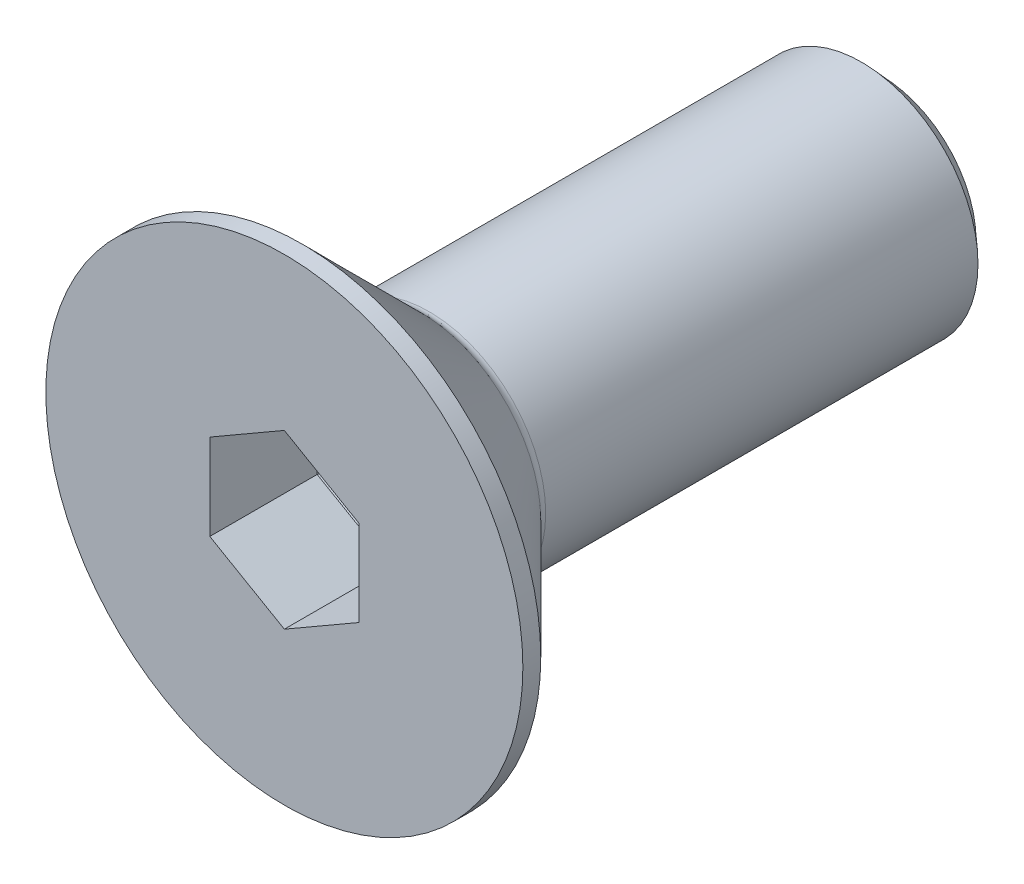
ISO-10303-21;
HEADER;
FILE_DESCRIPTION(('STEP AP214'),'2;1');
FILE_NAME('part.step','',(''),(''),'','','');
FILE_SCHEMA(('AUTOMOTIVE_DESIGN { 1 0 10303 214 1 1 1 1 }'));
ENDSEC;
DATA;
#1=APPLICATION_CONTEXT('core data for automotive mechanical design processes');
#2=APPLICATION_PROTOCOL_DEFINITION('international standard','automotive_design',2000,#1);
#3=PRODUCT_CONTEXT('',#1,'mechanical');
#4=PRODUCT('Part','Part','',(#3));
#5=PRODUCT_RELATED_PRODUCT_CATEGORY('part','',(#4));
#6=PRODUCT_DEFINITION_FORMATION('','',#4);
#7=PRODUCT_DEFINITION_CONTEXT('part definition',#1,'design');
#8=PRODUCT_DEFINITION('design','',#6,#7);
#9=PRODUCT_DEFINITION_SHAPE('','',#8);
#10=(LENGTH_UNIT() NAMED_UNIT(*) SI_UNIT(.MILLI.,.METRE.));
#11=(NAMED_UNIT(*) PLANE_ANGLE_UNIT() SI_UNIT($,.RADIAN.));
#12=(NAMED_UNIT(*) SI_UNIT($,.STERADIAN.) SOLID_ANGLE_UNIT());
#13=UNCERTAINTY_MEASURE_WITH_UNIT(LENGTH_MEASURE(1.E-05),#10,'distance_accuracy_value','');
#14=(GEOMETRIC_REPRESENTATION_CONTEXT(3) GLOBAL_UNCERTAINTY_ASSIGNED_CONTEXT((#13)) GLOBAL_UNIT_ASSIGNED_CONTEXT((#10,
#11,#12)) REPRESENTATION_CONTEXT('',''));
#15=CARTESIAN_POINT('',(0.,0.,0.));
#16=DIRECTION('',(0.,0.,1.));
#17=DIRECTION('',(1.,0.,0.));
#18=AXIS2_PLACEMENT_3D('',#15,#16,#17);
#19=CARTESIAN_POINT('',(0.,0.,-5.69999999999984));
#20=DIRECTION('',(0.,0.,-1.));
#21=DIRECTION('',(0.,-1.,0.));
#22=AXIS2_PLACEMENT_3D('',#19,#20,#21);
#23=PLANE('',#22);
#24=CARTESIAN_POINT('',(0.,0.,-5.69999999999984));
#25=DIRECTION('',(0.,0.,-1.));
#26=DIRECTION('',(-1.,0.,0.));
#27=AXIS2_PLACEMENT_3D('',#24,#25,#26);
#28=CIRCLE('',#27,1.6);
#29=CARTESIAN_POINT('',(1.6,0.,-5.69999999999984));
#30=VERTEX_POINT('',#29);
#31=EDGE_CURVE('E133',#30,#30,#28,.T.);
#32=ORIENTED_EDGE('',*,*,#31,.T.);
#33=EDGE_LOOP('',(#32));
#34=FACE_BOUND('',#33,.T.);
#35=ADVANCED_FACE('F17',(#34),#23,.T.);
#36=CARTESIAN_POINT('',(0.,0.,4.15000000000016));
#37=DIRECTION('',(0.,0.,-1.));
#38=DIRECTION('',(-1.,0.,0.));
#39=AXIS2_PLACEMENT_3D('',#36,#37,#38);
#40=CYLINDRICAL_SURFACE('',#39,4.);
#41=CARTESIAN_POINT('',(0.,0.,4.00000000000017));
#42=DIRECTION('',(0.,0.,-1.));
#43=DIRECTION('',(1.,0.,0.));
#44=AXIS2_PLACEMENT_3D('',#41,#42,#43);
#45=CIRCLE('',#44,4.);
#46=CARTESIAN_POINT('',(4.,0.,4.00000000000017));
#47=VERTEX_POINT('',#46);
#48=EDGE_CURVE('E126',#47,#47,#45,.T.);
#49=ORIENTED_EDGE('',*,*,#48,.F.);
#50=DIRECTION('',(0.,0.,1.));
#51=VECTOR('',#50,1.);
#52=CARTESIAN_POINT('',(4.,0.,4.15000000000017));
#53=LINE('',#52,#51);
#54=CARTESIAN_POINT('',(4.,0.,4.30000000000016));
#55=VERTEX_POINT('',#54);
#56=EDGE_CURVE('E11',#47,#55,#53,.T.);
#57=ORIENTED_EDGE('',*,*,#56,.T.);
#58=CARTESIAN_POINT('',(0.,0.,4.30000000000016));
#59=DIRECTION('',(0.,0.,-1.));
#60=DIRECTION('',(1.,0.,0.));
#61=AXIS2_PLACEMENT_3D('',#58,#59,#60);
#62=CIRCLE('',#61,4.);
#63=EDGE_CURVE('E162',#55,#55,#62,.T.);
#64=ORIENTED_EDGE('',*,*,#63,.T.);
#65=ORIENTED_EDGE('',*,*,#56,.F.);
#66=EDGE_LOOP('',(#49,#57,#64,#65));
#67=FACE_BOUND('',#66,.T.);
#68=ADVANCED_FACE('F19',(#67),#40,.T.);
#69=CARTESIAN_POINT('',(-1.25,-0.721687836487034,4.30000000000016));
#70=DIRECTION('',(-1.,0.,0.));
#71=DIRECTION('',(0.,0.,1.));
#72=AXIS2_PLACEMENT_3D('',#69,#70,#71);
#73=PLANE('',#72);
#74=DIRECTION('',(0.,1.,0.));
#75=VECTOR('',#74,1.);
#76=CARTESIAN_POINT('',(-1.25,-0.360843918243517,4.30000000000016));
#77=LINE('',#76,#75);
#78=CARTESIAN_POINT('',(-1.25,-0.721687836487034,4.30000000000016));
#79=VERTEX_POINT('',#78);
#80=CARTESIAN_POINT('',(-1.25,0.721687836487033,4.30000000000016));
#81=VERTEX_POINT('',#80);
#82=EDGE_CURVE('E191',#79,#81,#77,.T.);
#83=ORIENTED_EDGE('',*,*,#82,.F.);
#84=DIRECTION('',(0.,0.,-1.));
#85=VECTOR('',#84,1.);
#86=CARTESIAN_POINT('',(-1.25,-0.721687836487034,4.30000000000016));
#87=LINE('',#86,#85);
#88=CARTESIAN_POINT('',(-1.25,-0.721687836487034,2.50000000000016));
#89=VERTEX_POINT('',#88);
#90=EDGE_CURVE('E26',#79,#89,#87,.T.);
#91=ORIENTED_EDGE('',*,*,#90,.T.);
#92=DIRECTION('',(0.,1.,0.));
#93=VECTOR('',#92,1.);
#94=CARTESIAN_POINT('',(-1.25,-0.721687836487034,2.50000000000016));
#95=LINE('',#94,#93);
#96=CARTESIAN_POINT('',(-1.25,0.721687836487033,2.50000000000016));
#97=VERTEX_POINT('',#96);
#98=EDGE_CURVE('E170',#89,#97,#95,.T.);
#99=ORIENTED_EDGE('',*,*,#98,.T.);
#100=DIRECTION('',(0.,0.,-1.));
#101=VECTOR('',#100,1.);
#102=CARTESIAN_POINT('',(-1.25,0.721687836487033,4.30000000000016));
#103=LINE('',#102,#101);
#104=EDGE_CURVE('E217',#81,#97,#103,.T.);
#105=ORIENTED_EDGE('',*,*,#104,.F.);
#106=EDGE_LOOP('',(#83,#91,#99,#105));
#107=FACE_BOUND('',#106,.T.);
#108=ADVANCED_FACE('F244',(#107),#73,.F.);
#109=CARTESIAN_POINT('',(0.,-1.44337567297407,4.30000000000016));
#110=DIRECTION('',(-0.5,-0.866025403784439,0.));
#111=DIRECTION('',(-0.866025403784439,0.5,0.));
#112=AXIS2_PLACEMENT_3D('',#109,#110,#111);
#113=PLANE('',#112);
#114=DIRECTION('',(-0.866025403784439,0.5,0.));
#115=VECTOR('',#114,1.);
#116=CARTESIAN_POINT('',(-1.8125,-0.396928310067871,4.30000000000016));
#117=LINE('',#116,#115);
#118=CARTESIAN_POINT('',(0.,-1.44337567297407,4.30000000000016));
#119=VERTEX_POINT('',#118);
#120=EDGE_CURVE('E195',#119,#79,#117,.T.);
#121=ORIENTED_EDGE('',*,*,#120,.F.);
#122=DIRECTION('',(0.,0.,-1.));
#123=VECTOR('',#122,1.);
#124=CARTESIAN_POINT('',(0.,-1.44337567297407,4.30000000000016));
#125=LINE('',#124,#123);
#126=CARTESIAN_POINT('',(0.,-1.44337567297407,2.50000000000016));
#127=VERTEX_POINT('',#126);
#128=EDGE_CURVE('E47',#119,#127,#125,.T.);
#129=ORIENTED_EDGE('',*,*,#128,.T.);
#130=DIRECTION('',(-0.866025403784439,0.5,0.));
#131=VECTOR('',#130,1.);
#132=CARTESIAN_POINT('',(0.,-1.44337567297407,2.50000000000016));
#133=LINE('',#132,#131);
#134=EDGE_CURVE('E156',#127,#89,#133,.T.);
#135=ORIENTED_EDGE('',*,*,#134,.T.);
#136=ORIENTED_EDGE('',*,*,#90,.F.);
#137=EDGE_LOOP('',(#121,#129,#135,#136));
#138=FACE_BOUND('',#137,.T.);
#139=ADVANCED_FACE('F252',(#138),#113,.F.);
#140=CARTESIAN_POINT('',(1.25,-0.721687836487032,4.30000000000016));
#141=DIRECTION('',(0.5,-0.866025403784439,0.));
#142=DIRECTION('',(0.,0.,-1.));
#143=AXIS2_PLACEMENT_3D('',#140,#141,#142);
#144=PLANE('',#143);
#145=DIRECTION('',(-0.866025403784439,-0.5,0.));
#146=VECTOR('',#145,1.);
#147=CARTESIAN_POINT('',(-0.5625,-1.76813519939323,4.30000000000016));
#148=LINE('',#147,#146);
#149=CARTESIAN_POINT('',(1.25,-0.721687836487032,4.30000000000016));
#150=VERTEX_POINT('',#149);
#151=EDGE_CURVE('E229',#150,#119,#148,.T.);
#152=ORIENTED_EDGE('',*,*,#151,.F.);
#153=DIRECTION('',(0.,0.,-1.));
#154=VECTOR('',#153,1.);
#155=CARTESIAN_POINT('',(1.25,-0.721687836487032,4.30000000000016));
#156=LINE('',#155,#154);
#157=CARTESIAN_POINT('',(1.25,-0.721687836487032,2.50000000000016));
#158=VERTEX_POINT('',#157);
#159=EDGE_CURVE('E180',#150,#158,#156,.T.);
#160=ORIENTED_EDGE('',*,*,#159,.T.);
#161=DIRECTION('',(-0.866025403784439,-0.5,0.));
#162=VECTOR('',#161,1.);
#163=CARTESIAN_POINT('',(1.25,-0.721687836487032,2.50000000000016));
#164=LINE('',#163,#162);
#165=EDGE_CURVE('E155',#158,#127,#164,.T.);
#166=ORIENTED_EDGE('',*,*,#165,.T.);
#167=ORIENTED_EDGE('',*,*,#128,.F.);
#168=EDGE_LOOP('',(#152,#160,#166,#167));
#169=FACE_BOUND('',#168,.T.);
#170=ADVANCED_FACE('F471',(#169),#144,.F.);
#171=CARTESIAN_POINT('',(1.25,0.721687836487033,4.30000000000016));
#172=DIRECTION('',(1.,0.,0.));
#173=DIRECTION('',(0.,-1.,0.));
#174=AXIS2_PLACEMENT_3D('',#171,#172,#173);
#175=PLANE('',#174);
#176=DIRECTION('',(0.,-1.,0.));
#177=VECTOR('',#176,1.);
#178=CARTESIAN_POINT('',(1.25,0.360843918243516,4.30000000000016));
#179=LINE('',#178,#177);
#180=CARTESIAN_POINT('',(1.25,0.721687836487033,4.30000000000016));
#181=VERTEX_POINT('',#180);
#182=EDGE_CURVE('E161',#181,#150,#179,.T.);
#183=ORIENTED_EDGE('',*,*,#182,.F.);
#184=DIRECTION('',(0.,0.,-1.));
#185=VECTOR('',#184,1.);
#186=CARTESIAN_POINT('',(1.25,0.721687836487033,4.30000000000016));
#187=LINE('',#186,#185);
#188=CARTESIAN_POINT('',(1.25,0.721687836487033,2.50000000000016));
#189=VERTEX_POINT('',#188);
#190=EDGE_CURVE('E194',#181,#189,#187,.T.);
#191=ORIENTED_EDGE('',*,*,#190,.T.);
#192=DIRECTION('',(0.,-1.,0.));
#193=VECTOR('',#192,1.);
#194=CARTESIAN_POINT('',(1.25,0.721687836487033,2.50000000000016));
#195=LINE('',#194,#193);
#196=EDGE_CURVE('E186',#189,#158,#195,.T.);
#197=ORIENTED_EDGE('',*,*,#196,.T.);
#198=ORIENTED_EDGE('',*,*,#159,.F.);
#199=EDGE_LOOP('',(#183,#191,#197,#198));
#200=FACE_BOUND('',#199,.T.);
#201=ADVANCED_FACE('F480',(#200),#175,.F.);
#202=CARTESIAN_POINT('',(0.,1.44337567297407,4.30000000000016));
#203=DIRECTION('',(0.5,0.866025403784439,0.));
#204=DIRECTION('',(0.,0.,-1.));
#205=AXIS2_PLACEMENT_3D('',#202,#203,#204);
#206=PLANE('',#205);
#207=DIRECTION('',(0.866025403784439,-0.5,0.));
#208=VECTOR('',#207,1.);
#209=CARTESIAN_POINT('',(-1.1875,2.12897911763674,4.30000000000016));
#210=LINE('',#209,#208);
#211=CARTESIAN_POINT('',(0.,1.44337567297407,4.30000000000016));
#212=VERTEX_POINT('',#211);
#213=EDGE_CURVE('E157',#212,#181,#210,.T.);
#214=ORIENTED_EDGE('',*,*,#213,.F.);
#215=DIRECTION('',(0.,0.,-1.));
#216=VECTOR('',#215,1.);
#217=CARTESIAN_POINT('',(0.,1.44337567297407,4.30000000000016));
#218=LINE('',#217,#216);
#219=CARTESIAN_POINT('',(0.,1.44337567297407,2.50000000000016));
#220=VERTEX_POINT('',#219);
#221=EDGE_CURVE('E220',#212,#220,#218,.T.);
#222=ORIENTED_EDGE('',*,*,#221,.T.);
#223=DIRECTION('',(0.866025403784439,-0.5,0.));
#224=VECTOR('',#223,1.);
#225=CARTESIAN_POINT('',(0.,1.44337567297407,2.50000000000016));
#226=LINE('',#225,#224);
#227=EDGE_CURVE('E199',#220,#189,#226,.T.);
#228=ORIENTED_EDGE('',*,*,#227,.T.);
#229=ORIENTED_EDGE('',*,*,#190,.F.);
#230=EDGE_LOOP('',(#214,#222,#228,#229));
#231=FACE_BOUND('',#230,.T.);
#232=ADVANCED_FACE('F488',(#231),#206,.F.);
#233=CARTESIAN_POINT('',(-4.,0.,4.30000000000016));
#234=DIRECTION('',(0.,0.,1.));
#235=DIRECTION('',(1.,0.,0.));
#236=AXIS2_PLACEMENT_3D('',#233,#234,#235);
#237=PLANE('',#236);
#238=DIRECTION('',(0.866025403784439,0.5,0.));
#239=VECTOR('',#238,1.);
#240=CARTESIAN_POINT('',(-2.4375,0.0360843918243556,4.30000000000016));
#241=LINE('',#240,#239);
#242=EDGE_CURVE('E213',#81,#212,#241,.T.);
#243=ORIENTED_EDGE('',*,*,#242,.T.);
#244=ORIENTED_EDGE('',*,*,#213,.T.);
#245=ORIENTED_EDGE('',*,*,#182,.T.);
#246=ORIENTED_EDGE('',*,*,#151,.T.);
#247=ORIENTED_EDGE('',*,*,#120,.T.);
#248=ORIENTED_EDGE('',*,*,#82,.T.);
#249=EDGE_LOOP('',(#243,#244,#245,#246,#247,#248));
#250=FACE_BOUND('',#249,.T.);
#251=ORIENTED_EDGE('',*,*,#63,.F.);
#252=EDGE_LOOP('',(#251));
#253=FACE_BOUND('',#252,.T.);
#254=ADVANCED_FACE('F438',(#250,#253),#237,.T.);
#255=CARTESIAN_POINT('',(-1.25,0.721687836487033,4.30000000000016));
#256=DIRECTION('',(-0.5,0.866025403784439,0.));
#257=DIRECTION('',(0.,0.,1.));
#258=AXIS2_PLACEMENT_3D('',#255,#256,#257);
#259=PLANE('',#258);
#260=ORIENTED_EDGE('',*,*,#242,.F.);
#261=ORIENTED_EDGE('',*,*,#104,.T.);
#262=DIRECTION('',(0.866025403784439,0.5,0.));
#263=VECTOR('',#262,1.);
#264=CARTESIAN_POINT('',(-1.25,0.721687836487033,2.50000000000016));
#265=LINE('',#264,#263);
#266=EDGE_CURVE('E171',#97,#220,#265,.T.);
#267=ORIENTED_EDGE('',*,*,#266,.T.);
#268=ORIENTED_EDGE('',*,*,#221,.F.);
#269=EDGE_LOOP('',(#260,#261,#267,#268));
#270=FACE_BOUND('',#269,.T.);
#271=ADVANCED_FACE('F433',(#270),#259,.F.);
#272=CARTESIAN_POINT('',(-1.25,0.721687836487033,2.50000000000016));
#273=DIRECTION('',(-0.5,0.,-0.866025403784439));
#274=DIRECTION('',(-0.866025403784439,0.,0.5));
#275=AXIS2_PLACEMENT_3D('',#272,#273,#274);
#276=PLANE('',#275);
#277=DIRECTION('',(0.774596669241483,-0.447213595499958,-0.447213595499958));
#278=VECTOR('',#277,1.);
#279=CARTESIAN_POINT('',(-1.,0.577350269189628,2.35566243270275));
#280=LINE('',#279,#278);
#281=CARTESIAN_POINT('',(0.,0.,1.77831216351312));
#282=VERTEX_POINT('',#281);
#283=EDGE_CURVE('E167',#97,#282,#280,.T.);
#284=ORIENTED_EDGE('',*,*,#283,.F.);
#285=ORIENTED_EDGE('',*,*,#98,.F.);
#286=DIRECTION('',(0.774596669241483,0.447213595499958,-0.447213595499958));
#287=VECTOR('',#286,1.);
#288=CARTESIAN_POINT('',(-1.,-0.577350269189627,2.35566243270275));
#289=LINE('',#288,#287);
#290=EDGE_CURVE('E125',#89,#282,#289,.T.);
#291=ORIENTED_EDGE('',*,*,#290,.T.);
#292=EDGE_LOOP('',(#284,#285,#291));
#293=FACE_BOUND('',#292,.T.);
#294=ADVANCED_FACE('F248',(#293),#276,.F.);
#295=CARTESIAN_POINT('',(0.,1.44337567297407,2.50000000000016));
#296=DIRECTION('',(-0.25,0.43301270189222,-0.866025403784439));
#297=DIRECTION('',(-0.960768922830523,0.,0.277350098112614));
#298=AXIS2_PLACEMENT_3D('',#295,#296,#297);
#299=PLANE('',#298);
#300=DIRECTION('',(0.,-0.894427190999916,-0.447213595499958));
#301=VECTOR('',#300,1.);
#302=CARTESIAN_POINT('',(0.,1.15470053837925,2.35566243270275));
#303=LINE('',#302,#301);
#304=EDGE_CURVE('E203',#220,#282,#303,.T.);
#305=ORIENTED_EDGE('',*,*,#304,.F.);
#306=ORIENTED_EDGE('',*,*,#266,.F.);
#307=ORIENTED_EDGE('',*,*,#283,.T.);
#308=EDGE_LOOP('',(#305,#306,#307));
#309=FACE_BOUND('',#308,.T.);
#310=ADVANCED_FACE('F427',(#309),#299,.F.);
#311=CARTESIAN_POINT('',(1.25,0.721687836487033,2.50000000000016));
#312=DIRECTION('',(0.25,0.433012701892219,-0.866025403784439));
#313=DIRECTION('',(-0.960768922830523,0.,-0.277350098112614));
#314=AXIS2_PLACEMENT_3D('',#311,#312,#313);
#315=PLANE('',#314);
#316=DIRECTION('',(-0.774596669241483,-0.447213595499958,-0.447213595499958));
#317=VECTOR('',#316,1.);
#318=CARTESIAN_POINT('',(1.,0.577350269189627,2.35566243270275));
#319=LINE('',#318,#317);
#320=EDGE_CURVE('E190',#189,#282,#319,.T.);
#321=ORIENTED_EDGE('',*,*,#320,.F.);
#322=ORIENTED_EDGE('',*,*,#227,.F.);
#323=ORIENTED_EDGE('',*,*,#304,.T.);
#324=EDGE_LOOP('',(#321,#322,#323));
#325=FACE_BOUND('',#324,.T.);
#326=ADVANCED_FACE('F419',(#325),#315,.F.);
#327=CARTESIAN_POINT('',(1.25,-0.721687836487032,2.50000000000016));
#328=DIRECTION('',(0.5,0.,-0.866025403784439));
#329=DIRECTION('',(0.,-1.,0.));
#330=AXIS2_PLACEMENT_3D('',#327,#328,#329);
#331=PLANE('',#330);
#332=DIRECTION('',(-0.774596669241483,0.447213595499958,-0.447213595499958));
#333=VECTOR('',#332,1.);
#334=CARTESIAN_POINT('',(1.,-0.577350269189627,2.35566243270275));
#335=LINE('',#334,#333);
#336=EDGE_CURVE('E174',#158,#282,#335,.T.);
#337=ORIENTED_EDGE('',*,*,#336,.F.);
#338=ORIENTED_EDGE('',*,*,#196,.F.);
#339=ORIENTED_EDGE('',*,*,#320,.T.);
#340=EDGE_LOOP('',(#337,#338,#339));
#341=FACE_BOUND('',#340,.T.);
#342=ADVANCED_FACE('F381',(#341),#331,.F.);
#343=CARTESIAN_POINT('',(0.,-1.44337567297407,2.50000000000016));
#344=DIRECTION('',(0.25,-0.433012701892219,-0.866025403784439));
#345=DIRECTION('',(0.,-0.894427190999916,0.447213595499958));
#346=AXIS2_PLACEMENT_3D('',#343,#344,#345);
#347=PLANE('',#346);
#348=DIRECTION('',(0.,0.894427190999916,-0.447213595499958));
#349=VECTOR('',#348,1.);
#350=CARTESIAN_POINT('',(0.,-1.15470053837925,2.35566243270275));
#351=LINE('',#350,#349);
#352=EDGE_CURVE('E151',#127,#282,#351,.T.);
#353=ORIENTED_EDGE('',*,*,#352,.F.);
#354=ORIENTED_EDGE('',*,*,#165,.F.);
#355=ORIENTED_EDGE('',*,*,#336,.T.);
#356=EDGE_LOOP('',(#353,#354,#355));
#357=FACE_BOUND('',#356,.T.);
#358=ADVANCED_FACE('F259',(#357),#347,.F.);
#359=CARTESIAN_POINT('',(-1.25,-0.721687836487034,2.50000000000016));
#360=DIRECTION('',(-0.25,-0.433012701892219,-0.866025403784439));
#361=DIRECTION('',(0.,-0.894427190999916,0.447213595499958));
#362=AXIS2_PLACEMENT_3D('',#359,#360,#361);
#363=PLANE('',#362);
#364=ORIENTED_EDGE('',*,*,#290,.F.);
#365=ORIENTED_EDGE('',*,*,#134,.F.);
#366=ORIENTED_EDGE('',*,*,#352,.T.);
#367=EDGE_LOOP('',(#364,#365,#366));
#368=FACE_BOUND('',#367,.T.);
#369=ADVANCED_FACE('F254',(#368),#363,.F.);
#370=CARTESIAN_POINT('',(0.,0.,-1.84999999999984));
#371=DIRECTION('',(0.,0.,-1.));
#372=DIRECTION('',(-1.,0.,0.));
#373=AXIS2_PLACEMENT_3D('',#370,#371,#372);
#374=CYLINDRICAL_SURFACE('',#373,1.954);
#375=CARTESIAN_POINT('',(0.,0.,-5.37818181818166));
#376=DIRECTION('',(0.,0.,1.));
#377=DIRECTION('',(-1.,0.,0.));
#378=AXIS2_PLACEMENT_3D('',#375,#376,#377);
#379=CIRCLE('',#378,1.954);
#380=CARTESIAN_POINT('',(1.954,0.,-5.37818181818166));
#381=VERTEX_POINT('',#380);
#382=EDGE_CURVE('E120',#381,#381,#379,.T.);
#383=ORIENTED_EDGE('',*,*,#382,.T.);
#384=DIRECTION('',(0.,0.,1.));
#385=VECTOR('',#384,1.);
#386=CARTESIAN_POINT('',(1.954,0.,-1.84999999999984));
#387=LINE('',#386,#385);
#388=CARTESIAN_POINT('',(1.954,0.,1.87115728752547));
#389=VERTEX_POINT('',#388);
#390=EDGE_CURVE('E116',#381,#389,#387,.T.);
#391=ORIENTED_EDGE('',*,*,#390,.T.);
#392=CARTESIAN_POINT('',(0.,0.,1.87115728752547));
#393=DIRECTION('',(0.,0.,1.));
#394=DIRECTION('',(-1.,0.,0.));
#395=AXIS2_PLACEMENT_3D('',#392,#393,#394);
#396=CIRCLE('',#395,1.954);
#397=EDGE_CURVE('E122',#389,#389,#396,.T.);
#398=ORIENTED_EDGE('',*,*,#397,.F.);
#399=ORIENTED_EDGE('',*,*,#390,.F.);
#400=EDGE_LOOP('',(#383,#391,#398,#399));
#401=FACE_BOUND('',#400,.T.);
#402=ADVANCED_FACE('F118',(#401),#374,.T.);
#403=CARTESIAN_POINT('',(0.,0.,3.00000000000016));
#404=DIRECTION('',(0.,0.,1.));
#405=DIRECTION('',(-1.,0.,0.));
#406=AXIS2_PLACEMENT_3D('',#403,#404,#405);
#407=CONICAL_SURFACE('',#406,3.,0.785398163397426);
#408=CARTESIAN_POINT('',(0.,0.,2.01257864376277));
#409=DIRECTION('',(0.,0.,-1.));
#410=DIRECTION('',(-1.,0.,0.));
#411=AXIS2_PLACEMENT_3D('',#408,#409,#410);
#412=CIRCLE('',#411,2.01257864376269);
#413=CARTESIAN_POINT('',(2.0125786437627,0.,2.01257864376277));
#414=VERTEX_POINT('',#413);
#415=EDGE_CURVE('E141',#414,#414,#412,.T.);
#416=ORIENTED_EDGE('',*,*,#415,.F.);
#417=DIRECTION('',(0.707106781186531,0.,0.707106781186564));
#418=VECTOR('',#417,1.);
#419=CARTESIAN_POINT('',(3.00000000000005,0.,3.00000000000016));
#420=LINE('',#419,#418);
#421=EDGE_CURVE('E145',#414,#47,#420,.T.);
#422=ORIENTED_EDGE('',*,*,#421,.T.);
#423=ORIENTED_EDGE('',*,*,#48,.T.);
#424=ORIENTED_EDGE('',*,*,#421,.F.);
#425=EDGE_LOOP('',(#416,#422,#423,#424));
#426=FACE_BOUND('',#425,.T.);
#427=ADVANCED_FACE('F387',(#426),#407,.T.);
#428=CARTESIAN_POINT('',(0.,0.,1.87115728752547));
#429=DIRECTION('',(0.,0.,-1.));
#430=DIRECTION('',(-1.,0.,0.));
#431=AXIS2_PLACEMENT_3D('',#428,#429,#430);
#432=TOROIDAL_SURFACE('',#431,2.154,0.2);
#433=ORIENTED_EDGE('',*,*,#415,.T.);
#434=CARTESIAN_POINT('',(2.154,0.,1.87115728752547));
#435=DIRECTION('',(0.,-1.,0.));
#436=DIRECTION('',(1.,0.,0.));
#437=AXIS2_PLACEMENT_3D('',#434,#435,#436);
#438=CIRCLE('',#437,0.2);
#439=EDGE_CURVE('E150',#414,#389,#438,.T.);
#440=ORIENTED_EDGE('',*,*,#439,.T.);
#441=ORIENTED_EDGE('',*,*,#397,.T.);
#442=ORIENTED_EDGE('',*,*,#439,.F.);
#443=EDGE_LOOP('',(#433,#440,#441,#442));
#444=FACE_BOUND('',#443,.T.);
#445=ADVANCED_FACE('F372',(#444),#432,.F.);
#446=CARTESIAN_POINT('',(0.,0.,-5.49999999999984));
#447=DIRECTION('',(0.,0.,1.));
#448=DIRECTION('',(-1.,0.,0.));
#449=AXIS2_PLACEMENT_3D('',#446,#447,#448);
#450=CONICAL_SURFACE('',#449,1.82,0.832981266674435);
#451=ORIENTED_EDGE('',*,*,#382,.F.);
#452=DIRECTION('',(-0.739940073395945,0.,-0.672672793996311));
#453=VECTOR('',#452,1.);
#454=CARTESIAN_POINT('',(1.82,0.,-5.49999999999984));
#455=LINE('',#454,#453);
#456=EDGE_CURVE('E131',#381,#30,#455,.T.);
#457=ORIENTED_EDGE('',*,*,#456,.T.);
#458=ORIENTED_EDGE('',*,*,#31,.F.);
#459=ORIENTED_EDGE('',*,*,#456,.F.);
#460=EDGE_LOOP('',(#451,#457,#458,#459));
#461=FACE_BOUND('',#460,.T.);
#462=ADVANCED_FACE('F132',(#461),#450,.T.);
#463=CLOSED_SHELL('',(#35,#68,#108,#139,#170,#201,#232,#254,#271,#294,#310,#326,#342,#358,#369,
#402,#427,#445,#462));
#464=MANIFOLD_SOLID_BREP('B1',#463);
#465=ADVANCED_BREP_SHAPE_REPRESENTATION('',(#18,#464),#14);
#466=SHAPE_DEFINITION_REPRESENTATION(#9,#465);
ENDSEC;
END-ISO-10303-21;
